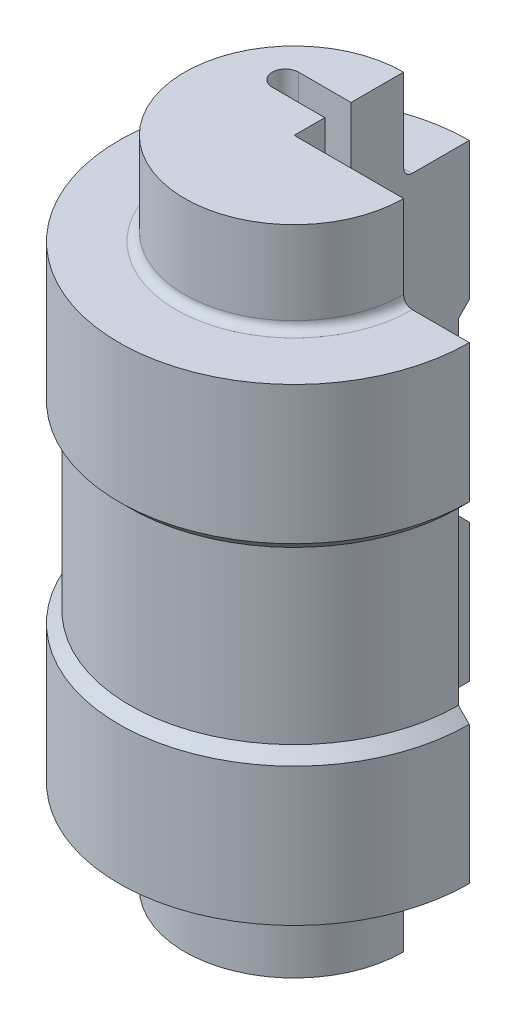
ISO-10303-21;
HEADER;
FILE_DESCRIPTION(('STEP AP214'),'2;1');
FILE_NAME('part.step','',(''),(''),'','','');
FILE_SCHEMA(('AUTOMOTIVE_DESIGN { 1 0 10303 214 1 1 1 1 }'));
ENDSEC;
DATA;
#1=APPLICATION_CONTEXT('core data for automotive mechanical design processes');
#2=APPLICATION_PROTOCOL_DEFINITION('international standard','automotive_design',2000,#1);
#3=PRODUCT_CONTEXT('',#1,'mechanical');
#4=PRODUCT('Part','Part','',(#3));
#5=PRODUCT_RELATED_PRODUCT_CATEGORY('part','',(#4));
#6=PRODUCT_DEFINITION_FORMATION('','',#4);
#7=PRODUCT_DEFINITION_CONTEXT('part definition',#1,'design');
#8=PRODUCT_DEFINITION('design','',#6,#7);
#9=PRODUCT_DEFINITION_SHAPE('','',#8);
#10=(LENGTH_UNIT() NAMED_UNIT(*) SI_UNIT(.MILLI.,.METRE.));
#11=(NAMED_UNIT(*) PLANE_ANGLE_UNIT() SI_UNIT($,.RADIAN.));
#12=(NAMED_UNIT(*) SI_UNIT($,.STERADIAN.) SOLID_ANGLE_UNIT());
#13=UNCERTAINTY_MEASURE_WITH_UNIT(LENGTH_MEASURE(1.E-05),#10,'distance_accuracy_value','');
#14=(GEOMETRIC_REPRESENTATION_CONTEXT(3) GLOBAL_UNCERTAINTY_ASSIGNED_CONTEXT((#13)) GLOBAL_UNIT_ASSIGNED_CONTEXT((#10,
#11,#12)) REPRESENTATION_CONTEXT('',''));
#15=CARTESIAN_POINT('',(0.,0.,0.));
#16=DIRECTION('',(0.,0.,1.));
#17=DIRECTION('',(1.,0.,0.));
#18=AXIS2_PLACEMENT_3D('',#15,#16,#17);
#19=CARTESIAN_POINT('',(0.,166.637084989848,0.));
#20=DIRECTION('',(0.,-1.,0.));
#21=DIRECTION('',(0.,0.,-1.));
#22=AXIS2_PLACEMENT_3D('',#19,#20,#21);
#23=CYLINDRICAL_SURFACE('',#22,37.5);
#24=CARTESIAN_POINT('',(0.,-19.5,0.));
#25=DIRECTION('',(0.,-1.,0.));
#26=DIRECTION('',(0.,0.,-1.));
#27=AXIS2_PLACEMENT_3D('',#24,#25,#26);
#28=CIRCLE('',#27,37.5);
#29=CARTESIAN_POINT('',(37.5,-19.5,0.));
#30=VERTEX_POINT('',#29);
#31=CARTESIAN_POINT('',(0.,-19.5,-37.5));
#32=VERTEX_POINT('',#31);
#33=EDGE_CURVE('E287',#30,#32,#28,.T.);
#34=ORIENTED_EDGE('',*,*,#33,.F.);
#35=DIRECTION('',(0.,-1.,0.));
#36=VECTOR('',#35,1.);
#37=CARTESIAN_POINT('',(37.5,166.637084989848,0.));
#38=LINE('',#37,#36);
#39=CARTESIAN_POINT('',(37.5,19.5,0.));
#40=VERTEX_POINT('',#39);
#41=EDGE_CURVE('E54',#30,#40,#38,.F.);
#42=ORIENTED_EDGE('',*,*,#41,.T.);
#43=CARTESIAN_POINT('',(0.,19.5,0.));
#44=DIRECTION('',(0.,1.,0.));
#45=DIRECTION('',(0.,0.,1.));
#46=AXIS2_PLACEMENT_3D('',#43,#44,#45);
#47=CIRCLE('',#46,37.5);
#48=CARTESIAN_POINT('',(0.,19.5,-37.5));
#49=VERTEX_POINT('',#48);
#50=EDGE_CURVE('E284',#49,#40,#47,.T.);
#51=ORIENTED_EDGE('',*,*,#50,.F.);
#52=DIRECTION('',(0.,-1.,0.));
#53=VECTOR('',#52,1.);
#54=CARTESIAN_POINT('',(0.,166.637084989848,-37.5));
#55=LINE('',#54,#53);
#56=EDGE_CURVE('E165',#49,#32,#55,.T.);
#57=ORIENTED_EDGE('',*,*,#56,.T.);
#58=EDGE_LOOP('',(#34,#42,#51,#57));
#59=FACE_BOUND('',#58,.T.);
#60=ADVANCED_FACE('F39',(#59),#23,.T.);
#61=CARTESIAN_POINT('',(0.,74.5,0.));
#62=DIRECTION('',(0.,-1.,0.));
#63=DIRECTION('',(0.,0.,-1.));
#64=AXIS2_PLACEMENT_3D('',#61,#62,#63);
#65=CYLINDRICAL_SURFACE('',#64,40.);
#66=CARTESIAN_POINT('',(0.,22.,0.));
#67=DIRECTION('',(0.,1.,0.));
#68=DIRECTION('',(0.,0.,1.));
#69=AXIS2_PLACEMENT_3D('',#66,#67,#68);
#70=CIRCLE('',#69,40.);
#71=CARTESIAN_POINT('',(0.,22.,-40.));
#72=VERTEX_POINT('',#71);
#73=CARTESIAN_POINT('',(40.,22.,0.));
#74=VERTEX_POINT('',#73);
#75=EDGE_CURVE('E237',#72,#74,#70,.T.);
#76=ORIENTED_EDGE('',*,*,#75,.T.);
#77=DIRECTION('',(0.,1.,0.));
#78=VECTOR('',#77,1.);
#79=CARTESIAN_POINT('',(40.,-74.5,0.));
#80=LINE('',#79,#78);
#81=CARTESIAN_POINT('',(40.,53.5,0.));
#82=VERTEX_POINT('',#81);
#83=EDGE_CURVE('E185',#74,#82,#80,.T.);
#84=ORIENTED_EDGE('',*,*,#83,.T.);
#85=CARTESIAN_POINT('',(0.,53.5,0.));
#86=DIRECTION('',(0.,1.,0.));
#87=DIRECTION('',(0.,0.,1.));
#88=AXIS2_PLACEMENT_3D('',#85,#86,#87);
#89=CIRCLE('',#88,40.);
#90=CARTESIAN_POINT('',(0.,53.5,-40.));
#91=VERTEX_POINT('',#90);
#92=EDGE_CURVE('E269',#91,#82,#89,.T.);
#93=ORIENTED_EDGE('',*,*,#92,.F.);
#94=DIRECTION('',(0.,1.,0.));
#95=VECTOR('',#94,1.);
#96=CARTESIAN_POINT('',(0.,-74.5,-40.));
#97=LINE('',#96,#95);
#98=EDGE_CURVE('E190',#72,#91,#97,.T.);
#99=ORIENTED_EDGE('',*,*,#98,.F.);
#100=EDGE_LOOP('',(#76,#84,#93,#99));
#101=FACE_BOUND('',#100,.T.);
#102=ADVANCED_FACE('F337',(#101),#65,.T.);
#103=CARTESIAN_POINT('',(0.,53.5,0.));
#104=DIRECTION('',(0.,1.,0.));
#105=DIRECTION('',(0.,0.,1.));
#106=AXIS2_PLACEMENT_3D('',#103,#104,#105);
#107=PLANE('',#106);
#108=DIRECTION('',(1.,0.,0.));
#109=VECTOR('',#108,1.);
#110=CARTESIAN_POINT('',(0.,53.5,0.));
#111=LINE('',#110,#109);
#112=CARTESIAN_POINT('',(27.,53.5,0.));
#113=VERTEX_POINT('',#112);
#114=EDGE_CURVE('E229',#113,#82,#111,.T.);
#115=ORIENTED_EDGE('',*,*,#114,.F.);
#116=CARTESIAN_POINT('',(0.,53.5,0.));
#117=DIRECTION('',(0.,1.,0.));
#118=DIRECTION('',(0.,0.,1.));
#119=AXIS2_PLACEMENT_3D('',#116,#117,#118);
#120=CIRCLE('',#119,27.);
#121=CARTESIAN_POINT('',(0.,53.5,-27.));
#122=VERTEX_POINT('',#121);
#123=EDGE_CURVE('E281',#113,#122,#120,.F.);
#124=ORIENTED_EDGE('',*,*,#123,.T.);
#125=DIRECTION('',(0.,0.,1.));
#126=VECTOR('',#125,1.);
#127=CARTESIAN_POINT('',(0.,53.5,0.));
#128=LINE('',#127,#126);
#129=EDGE_CURVE('E205',#91,#122,#128,.T.);
#130=ORIENTED_EDGE('',*,*,#129,.F.);
#131=ORIENTED_EDGE('',*,*,#92,.T.);
#132=EDGE_LOOP('',(#115,#124,#130,#131));
#133=FACE_BOUND('',#132,.T.);
#134=ADVANCED_FACE('F332',(#133),#107,.T.);
#135=CARTESIAN_POINT('',(0.,53.5,0.));
#136=DIRECTION('',(0.,1.,0.));
#137=DIRECTION('',(0.,0.,1.));
#138=AXIS2_PLACEMENT_3D('',#135,#136,#137);
#139=CYLINDRICAL_SURFACE('',#138,25.);
#140=DIRECTION('',(0.,1.,0.));
#141=VECTOR('',#140,1.);
#142=CARTESIAN_POINT('',(25.,53.5,0.));
#143=LINE('',#142,#141);
#144=CARTESIAN_POINT('',(25.,74.5,0.));
#145=VERTEX_POINT('',#144);
#146=CARTESIAN_POINT('',(25.,55.5,0.));
#147=VERTEX_POINT('',#146);
#148=EDGE_CURVE('E227',#145,#147,#143,.F.);
#149=ORIENTED_EDGE('',*,*,#148,.F.);
#150=CARTESIAN_POINT('',(0.,74.5,0.));
#151=DIRECTION('',(0.,1.,0.));
#152=DIRECTION('',(0.,0.,1.));
#153=AXIS2_PLACEMENT_3D('',#150,#151,#152);
#154=CIRCLE('',#153,25.);
#155=CARTESIAN_POINT('',(0.,74.5,-25.));
#156=VERTEX_POINT('',#155);
#157=EDGE_CURVE('E266',#156,#145,#154,.T.);
#158=ORIENTED_EDGE('',*,*,#157,.F.);
#159=DIRECTION('',(0.,1.,0.));
#160=VECTOR('',#159,1.);
#161=CARTESIAN_POINT('',(0.,53.5,-25.));
#162=LINE('',#161,#160);
#163=CARTESIAN_POINT('',(0.,55.5,-25.));
#164=VERTEX_POINT('',#163);
#165=EDGE_CURVE('E203',#164,#156,#162,.T.);
#166=ORIENTED_EDGE('',*,*,#165,.F.);
#167=CARTESIAN_POINT('',(0.,55.5,0.));
#168=DIRECTION('',(0.,1.,0.));
#169=DIRECTION('',(0.,0.,1.));
#170=AXIS2_PLACEMENT_3D('',#167,#168,#169);
#171=CIRCLE('',#170,25.);
#172=EDGE_CURVE('E278',#164,#147,#171,.T.);
#173=ORIENTED_EDGE('',*,*,#172,.T.);
#174=EDGE_LOOP('',(#149,#158,#166,#173));
#175=FACE_BOUND('',#174,.T.);
#176=ADVANCED_FACE('F325',(#175),#139,.T.);
#177=CARTESIAN_POINT('',(0.,74.5,0.));
#178=DIRECTION('',(0.,1.,0.));
#179=DIRECTION('',(0.,0.,1.));
#180=AXIS2_PLACEMENT_3D('',#177,#178,#179);
#181=PLANE('',#180);
#182=DIRECTION('',(0.,0.,1.));
#183=VECTOR('',#182,1.);
#184=CARTESIAN_POINT('',(0.,74.5,0.));
#185=LINE('',#184,#183);
#186=CARTESIAN_POINT('',(0.,74.5,-13.));
#187=VERTEX_POINT('',#186);
#188=EDGE_CURVE('E175',#156,#187,#185,.T.);
#189=ORIENTED_EDGE('',*,*,#188,.F.);
#190=ORIENTED_EDGE('',*,*,#157,.T.);
#191=DIRECTION('',(1.,0.,0.));
#192=VECTOR('',#191,1.);
#193=CARTESIAN_POINT('',(0.,74.5,0.));
#194=LINE('',#193,#192);
#195=CARTESIAN_POINT('',(0.,74.5,0.));
#196=VERTEX_POINT('',#195);
#197=EDGE_CURVE('E187',#196,#145,#194,.T.);
#198=ORIENTED_EDGE('',*,*,#197,.F.);
#199=CARTESIAN_POINT('',(0.,74.5,-7.));
#200=VERTEX_POINT('',#199);
#201=EDGE_CURVE('E163',#200,#196,#185,.T.);
#202=ORIENTED_EDGE('',*,*,#201,.F.);
#203=DIRECTION('',(1.,0.,0.));
#204=VECTOR('',#203,1.);
#205=CARTESIAN_POINT('',(-12.,74.5,-7.));
#206=LINE('',#205,#204);
#207=CARTESIAN_POINT('',(-12.,74.5,-7.));
#208=VERTEX_POINT('',#207);
#209=EDGE_CURVE('E249',#208,#200,#206,.T.);
#210=ORIENTED_EDGE('',*,*,#209,.F.);
#211=CARTESIAN_POINT('',(-12.,74.5,-10.));
#212=DIRECTION('',(0.,1.,0.));
#213=DIRECTION('',(0.,0.,1.));
#214=AXIS2_PLACEMENT_3D('',#211,#212,#213);
#215=CIRCLE('',#214,3.);
#216=CARTESIAN_POINT('',(-12.,74.5,-13.));
#217=VERTEX_POINT('',#216);
#218=EDGE_CURVE('E240',#217,#208,#215,.T.);
#219=ORIENTED_EDGE('',*,*,#218,.F.);
#220=DIRECTION('',(-1.,0.,0.));
#221=VECTOR('',#220,1.);
#222=CARTESIAN_POINT('',(-12.,74.5,-13.));
#223=LINE('',#222,#221);
#224=EDGE_CURVE('E243',#187,#217,#223,.T.);
#225=ORIENTED_EDGE('',*,*,#224,.F.);
#226=EDGE_LOOP('',(#189,#190,#198,#202,#210,#219,#225));
#227=FACE_BOUND('',#226,.T.);
#228=ADVANCED_FACE('F321',(#227),#181,.T.);
#229=CARTESIAN_POINT('',(0.,-74.5,0.));
#230=DIRECTION('',(0.,1.,0.));
#231=DIRECTION('',(0.,0.,1.));
#232=AXIS2_PLACEMENT_3D('',#229,#230,#231);
#233=PLANE('',#232);
#234=CARTESIAN_POINT('',(0.,-74.5,0.));
#235=DIRECTION('',(0.,1.,0.));
#236=DIRECTION('',(0.,0.,1.));
#237=AXIS2_PLACEMENT_3D('',#234,#235,#236);
#238=CIRCLE('',#237,25.);
#239=CARTESIAN_POINT('',(0.,-74.5,-25.));
#240=VERTEX_POINT('',#239);
#241=CARTESIAN_POINT('',(25.,-74.5,0.));
#242=VERTEX_POINT('',#241);
#243=EDGE_CURVE('E261',#240,#242,#238,.T.);
#244=ORIENTED_EDGE('',*,*,#243,.F.);
#245=DIRECTION('',(0.,0.,1.));
#246=VECTOR('',#245,1.);
#247=CARTESIAN_POINT('',(0.,-74.5,0.));
#248=LINE('',#247,#246);
#249=CARTESIAN_POINT('',(0.,-74.5,-13.));
#250=VERTEX_POINT('',#249);
#251=EDGE_CURVE('E182',#240,#250,#248,.T.);
#252=ORIENTED_EDGE('',*,*,#251,.T.);
#253=DIRECTION('',(-1.,0.,0.));
#254=VECTOR('',#253,1.);
#255=CARTESIAN_POINT('',(-12.,-74.5,-13.));
#256=LINE('',#255,#254);
#257=CARTESIAN_POINT('',(-12.,-74.5,-13.));
#258=VERTEX_POINT('',#257);
#259=EDGE_CURVE('E245',#250,#258,#256,.T.);
#260=ORIENTED_EDGE('',*,*,#259,.T.);
#261=CARTESIAN_POINT('',(-12.,-74.5,-10.));
#262=DIRECTION('',(0.,1.,0.));
#263=DIRECTION('',(0.,0.,1.));
#264=AXIS2_PLACEMENT_3D('',#261,#262,#263);
#265=CIRCLE('',#264,3.);
#266=CARTESIAN_POINT('',(-12.,-74.5,-7.));
#267=VERTEX_POINT('',#266);
#268=EDGE_CURVE('E241',#258,#267,#265,.T.);
#269=ORIENTED_EDGE('',*,*,#268,.T.);
#270=DIRECTION('',(1.,0.,0.));
#271=VECTOR('',#270,1.);
#272=CARTESIAN_POINT('',(-12.,-74.5,-7.));
#273=LINE('',#272,#271);
#274=CARTESIAN_POINT('',(0.,-74.5,-7.));
#275=VERTEX_POINT('',#274);
#276=EDGE_CURVE('E181',#267,#275,#273,.T.);
#277=ORIENTED_EDGE('',*,*,#276,.T.);
#278=CARTESIAN_POINT('',(0.,-74.5,0.));
#279=VERTEX_POINT('',#278);
#280=EDGE_CURVE('E160',#275,#279,#248,.T.);
#281=ORIENTED_EDGE('',*,*,#280,.T.);
#282=DIRECTION('',(1.,0.,0.));
#283=VECTOR('',#282,1.);
#284=CARTESIAN_POINT('',(0.,-74.5,0.));
#285=LINE('',#284,#283);
#286=EDGE_CURVE('E168',#279,#242,#285,.T.);
#287=ORIENTED_EDGE('',*,*,#286,.T.);
#288=EDGE_LOOP('',(#244,#252,#260,#269,#277,#281,#287));
#289=FACE_BOUND('',#288,.T.);
#290=ADVANCED_FACE('F178',(#289),#233,.F.);
#291=CARTESIAN_POINT('',(0.,-53.5,0.));
#292=DIRECTION('',(0.,-1.,0.));
#293=DIRECTION('',(0.,0.,-1.));
#294=AXIS2_PLACEMENT_3D('',#291,#292,#293);
#295=CYLINDRICAL_SURFACE('',#294,25.);
#296=ORIENTED_EDGE('',*,*,#243,.T.);
#297=DIRECTION('',(0.,-1.,0.));
#298=VECTOR('',#297,1.);
#299=CARTESIAN_POINT('',(25.,-53.5,0.));
#300=LINE('',#299,#298);
#301=CARTESIAN_POINT('',(25.,-55.5,0.));
#302=VERTEX_POINT('',#301);
#303=EDGE_CURVE('E171',#242,#302,#300,.F.);
#304=ORIENTED_EDGE('',*,*,#303,.T.);
#305=CARTESIAN_POINT('',(0.,-55.5,0.));
#306=DIRECTION('',(0.,-1.,0.));
#307=DIRECTION('',(0.,0.,-1.));
#308=AXIS2_PLACEMENT_3D('',#305,#306,#307);
#309=CIRCLE('',#308,25.);
#310=CARTESIAN_POINT('',(0.,-55.5,-25.));
#311=VERTEX_POINT('',#310);
#312=EDGE_CURVE('E275',#302,#311,#309,.T.);
#313=ORIENTED_EDGE('',*,*,#312,.T.);
#314=DIRECTION('',(0.,-1.,0.));
#315=VECTOR('',#314,1.);
#316=CARTESIAN_POINT('',(0.,-53.5,-25.));
#317=LINE('',#316,#315);
#318=EDGE_CURVE('E212',#311,#240,#317,.T.);
#319=ORIENTED_EDGE('',*,*,#318,.T.);
#320=EDGE_LOOP('',(#296,#304,#313,#319));
#321=FACE_BOUND('',#320,.T.);
#322=ADVANCED_FACE('F306',(#321),#295,.T.);
#323=CARTESIAN_POINT('',(0.,-53.5,0.));
#324=DIRECTION('',(0.,-1.,0.));
#325=DIRECTION('',(0.,0.,1.));
#326=AXIS2_PLACEMENT_3D('',#323,#324,#325);
#327=PLANE('',#326);
#328=DIRECTION('',(-1.,0.,0.));
#329=VECTOR('',#328,1.);
#330=CARTESIAN_POINT('',(0.,-53.5,0.));
#331=LINE('',#330,#329);
#332=CARTESIAN_POINT('',(40.,-53.5,0.));
#333=VERTEX_POINT('',#332);
#334=CARTESIAN_POINT('',(27.,-53.5,0.));
#335=VERTEX_POINT('',#334);
#336=EDGE_CURVE('E234',#333,#335,#331,.T.);
#337=ORIENTED_EDGE('',*,*,#336,.F.);
#338=CARTESIAN_POINT('',(0.,-53.5,0.));
#339=DIRECTION('',(0.,1.,0.));
#340=DIRECTION('',(0.,0.,1.));
#341=AXIS2_PLACEMENT_3D('',#338,#339,#340);
#342=CIRCLE('',#341,40.);
#343=CARTESIAN_POINT('',(0.,-53.5,-40.));
#344=VERTEX_POINT('',#343);
#345=EDGE_CURVE('E263',#344,#333,#342,.T.);
#346=ORIENTED_EDGE('',*,*,#345,.F.);
#347=DIRECTION('',(0.,0.,-1.));
#348=VECTOR('',#347,1.);
#349=CARTESIAN_POINT('',(0.,-53.5,0.));
#350=LINE('',#349,#348);
#351=CARTESIAN_POINT('',(0.,-53.5,-27.));
#352=VERTEX_POINT('',#351);
#353=EDGE_CURVE('E210',#352,#344,#350,.T.);
#354=ORIENTED_EDGE('',*,*,#353,.F.);
#355=CARTESIAN_POINT('',(0.,-53.5,0.));
#356=DIRECTION('',(0.,-1.,0.));
#357=DIRECTION('',(0.,0.,-1.));
#358=AXIS2_PLACEMENT_3D('',#355,#356,#357);
#359=CIRCLE('',#358,27.);
#360=EDGE_CURVE('E272',#352,#335,#359,.F.);
#361=ORIENTED_EDGE('',*,*,#360,.T.);
#362=EDGE_LOOP('',(#337,#346,#354,#361));
#363=FACE_BOUND('',#362,.T.);
#364=ADVANCED_FACE('F299',(#363),#327,.T.);
#365=ORIENTED_EDGE('',*,*,#345,.T.);
#366=CARTESIAN_POINT('',(40.,-22.,0.));
#367=VERTEX_POINT('',#366);
#368=EDGE_CURVE('E192',#333,#367,#80,.T.);
#369=ORIENTED_EDGE('',*,*,#368,.T.);
#370=CARTESIAN_POINT('',(0.,-22.,0.));
#371=DIRECTION('',(0.,-1.,0.));
#372=DIRECTION('',(0.,0.,-1.));
#373=AXIS2_PLACEMENT_3D('',#370,#371,#372);
#374=CIRCLE('',#373,40.);
#375=CARTESIAN_POINT('',(0.,-22.,-40.));
#376=VERTEX_POINT('',#375);
#377=EDGE_CURVE('E256',#376,#367,#374,.F.);
#378=ORIENTED_EDGE('',*,*,#377,.F.);
#379=EDGE_CURVE('E61',#344,#376,#97,.T.);
#380=ORIENTED_EDGE('',*,*,#379,.F.);
#381=EDGE_LOOP('',(#365,#369,#378,#380));
#382=FACE_BOUND('',#381,.T.);
#383=ADVANCED_FACE('F295',(#382),#65,.T.);
#384=CARTESIAN_POINT('',(-12.,-74.5,-10.));
#385=DIRECTION('',(0.,1.,0.));
#386=DIRECTION('',(0.,0.,1.));
#387=AXIS2_PLACEMENT_3D('',#384,#385,#386);
#388=CYLINDRICAL_SURFACE('',#387,3.);
#389=ORIENTED_EDGE('',*,*,#218,.T.);
#390=DIRECTION('',(0.,1.,0.));
#391=VECTOR('',#390,1.);
#392=CARTESIAN_POINT('',(-12.,-74.5,-7.));
#393=LINE('',#392,#391);
#394=EDGE_CURVE('E247',#267,#208,#393,.T.);
#395=ORIENTED_EDGE('',*,*,#394,.F.);
#396=ORIENTED_EDGE('',*,*,#268,.F.);
#397=DIRECTION('',(0.,1.,0.));
#398=VECTOR('',#397,1.);
#399=CARTESIAN_POINT('',(-12.,-74.5,-13.));
#400=LINE('',#399,#398);
#401=EDGE_CURVE('E253',#258,#217,#400,.T.);
#402=ORIENTED_EDGE('',*,*,#401,.T.);
#403=EDGE_LOOP('',(#389,#395,#396,#402));
#404=FACE_BOUND('',#403,.T.);
#405=ADVANCED_FACE('F315',(#404),#388,.F.);
#406=CARTESIAN_POINT('',(-12.,-74.5,-13.));
#407=DIRECTION('',(0.,0.,-1.));
#408=DIRECTION('',(-1.,0.,0.));
#409=AXIS2_PLACEMENT_3D('',#406,#407,#408);
#410=PLANE('',#409);
#411=ORIENTED_EDGE('',*,*,#259,.F.);
#412=DIRECTION('',(0.,1.,0.));
#413=VECTOR('',#412,1.);
#414=CARTESIAN_POINT('',(0.,-74.5,-13.));
#415=LINE('',#414,#413);
#416=EDGE_CURVE('E217',#250,#187,#415,.T.);
#417=ORIENTED_EDGE('',*,*,#416,.T.);
#418=ORIENTED_EDGE('',*,*,#224,.T.);
#419=ORIENTED_EDGE('',*,*,#401,.F.);
#420=EDGE_LOOP('',(#411,#417,#418,#419));
#421=FACE_BOUND('',#420,.T.);
#422=ADVANCED_FACE('F310',(#421),#410,.F.);
#423=CARTESIAN_POINT('',(-12.,-74.5,-7.));
#424=DIRECTION('',(0.,0.,1.));
#425=DIRECTION('',(1.,0.,0.));
#426=AXIS2_PLACEMENT_3D('',#423,#424,#425);
#427=PLANE('',#426);
#428=ORIENTED_EDGE('',*,*,#209,.T.);
#429=DIRECTION('',(0.,-1.,0.));
#430=VECTOR('',#429,1.);
#431=CARTESIAN_POINT('',(0.,-74.5,-7.));
#432=LINE('',#431,#430);
#433=EDGE_CURVE('E215',#200,#275,#432,.T.);
#434=ORIENTED_EDGE('',*,*,#433,.T.);
#435=ORIENTED_EDGE('',*,*,#276,.F.);
#436=ORIENTED_EDGE('',*,*,#394,.T.);
#437=EDGE_LOOP('',(#428,#434,#435,#436));
#438=FACE_BOUND('',#437,.T.);
#439=ADVANCED_FACE('F318',(#438),#427,.F.);
#440=CARTESIAN_POINT('',(0.,-55.5,0.));
#441=DIRECTION('',(0.,-1.,0.));
#442=DIRECTION('',(0.,0.,-1.));
#443=AXIS2_PLACEMENT_3D('',#440,#441,#442);
#444=TOROIDAL_SURFACE('',#443,27.,2.);
#445=ORIENTED_EDGE('',*,*,#312,.F.);
#446=CARTESIAN_POINT('',(27.,-55.5,0.));
#447=DIRECTION('',(0.,0.,1.));
#448=DIRECTION('',(1.,0.,0.));
#449=AXIS2_PLACEMENT_3D('',#446,#447,#448);
#450=CIRCLE('',#449,2.);
#451=EDGE_CURVE('E231',#302,#335,#450,.F.);
#452=ORIENTED_EDGE('',*,*,#451,.T.);
#453=ORIENTED_EDGE('',*,*,#360,.F.);
#454=CARTESIAN_POINT('',(0.,-55.5,-27.));
#455=DIRECTION('',(-1.,0.,0.));
#456=DIRECTION('',(0.,0.,1.));
#457=AXIS2_PLACEMENT_3D('',#454,#455,#456);
#458=CIRCLE('',#457,2.);
#459=EDGE_CURVE('E207',#352,#311,#458,.F.);
#460=ORIENTED_EDGE('',*,*,#459,.T.);
#461=EDGE_LOOP('',(#445,#452,#453,#460));
#462=FACE_BOUND('',#461,.T.);
#463=ADVANCED_FACE('F304',(#462),#444,.F.);
#464=CARTESIAN_POINT('',(0.,55.5,0.));
#465=DIRECTION('',(0.,1.,0.));
#466=DIRECTION('',(0.,0.,1.));
#467=AXIS2_PLACEMENT_3D('',#464,#465,#466);
#468=TOROIDAL_SURFACE('',#467,27.,2.);
#469=ORIENTED_EDGE('',*,*,#123,.F.);
#470=CARTESIAN_POINT('',(27.,55.5,0.));
#471=DIRECTION('',(0.,0.,1.));
#472=DIRECTION('',(1.,0.,0.));
#473=AXIS2_PLACEMENT_3D('',#470,#471,#472);
#474=CIRCLE('',#473,2.);
#475=EDGE_CURVE('E224',#113,#147,#474,.F.);
#476=ORIENTED_EDGE('',*,*,#475,.T.);
#477=ORIENTED_EDGE('',*,*,#172,.F.);
#478=CARTESIAN_POINT('',(0.,55.5,-27.));
#479=DIRECTION('',(-1.,0.,0.));
#480=DIRECTION('',(0.,0.,1.));
#481=AXIS2_PLACEMENT_3D('',#478,#479,#480);
#482=CIRCLE('',#481,2.);
#483=EDGE_CURVE('E200',#164,#122,#482,.F.);
#484=ORIENTED_EDGE('',*,*,#483,.T.);
#485=EDGE_LOOP('',(#469,#476,#477,#484));
#486=FACE_BOUND('',#485,.T.);
#487=ADVANCED_FACE('F41',(#486),#468,.F.);
#488=CARTESIAN_POINT('',(0.,19.5,0.));
#489=DIRECTION('',(0.,1.,0.));
#490=DIRECTION('',(0.,0.,1.));
#491=AXIS2_PLACEMENT_3D('',#488,#489,#490);
#492=CONICAL_SURFACE('',#491,37.5,0.785398163397443);
#493=ORIENTED_EDGE('',*,*,#50,.T.);
#494=DIRECTION('',(0.707106781186544,0.707106781186551,0.));
#495=VECTOR('',#494,1.);
#496=CARTESIAN_POINT('',(0.,-18.0000000000004,0.));
#497=LINE('',#496,#495);
#498=EDGE_CURVE('E221',#40,#74,#497,.T.);
#499=ORIENTED_EDGE('',*,*,#498,.T.);
#500=ORIENTED_EDGE('',*,*,#75,.F.);
#501=DIRECTION('',(0.,-0.707106781186551,0.707106781186544));
#502=VECTOR('',#501,1.);
#503=CARTESIAN_POINT('',(0.,-18.0000000000004,0.));
#504=LINE('',#503,#502);
#505=EDGE_CURVE('E197',#72,#49,#504,.T.);
#506=ORIENTED_EDGE('',*,*,#505,.T.);
#507=EDGE_LOOP('',(#493,#499,#500,#506));
#508=FACE_BOUND('',#507,.T.);
#509=ADVANCED_FACE('F340',(#508),#492,.T.);
#510=CARTESIAN_POINT('',(0.,-19.5,0.));
#511=DIRECTION('',(0.,-1.,0.));
#512=DIRECTION('',(0.,0.,1.));
#513=AXIS2_PLACEMENT_3D('',#510,#511,#512);
#514=CONICAL_SURFACE('',#513,37.5,0.785398163397443);
#515=ORIENTED_EDGE('',*,*,#377,.T.);
#516=DIRECTION('',(-0.707106781186544,0.707106781186551,0.));
#517=VECTOR('',#516,1.);
#518=CARTESIAN_POINT('',(0.,18.0000000000004,0.));
#519=LINE('',#518,#517);
#520=EDGE_CURVE('E12',#367,#30,#519,.T.);
#521=ORIENTED_EDGE('',*,*,#520,.T.);
#522=ORIENTED_EDGE('',*,*,#33,.T.);
#523=DIRECTION('',(0.,-0.707106781186551,-0.707106781186544));
#524=VECTOR('',#523,1.);
#525=CARTESIAN_POINT('',(0.,18.0000000000004,0.));
#526=LINE('',#525,#524);
#527=EDGE_CURVE('E47',#32,#376,#526,.T.);
#528=ORIENTED_EDGE('',*,*,#527,.T.);
#529=EDGE_LOOP('',(#515,#521,#522,#528));
#530=FACE_BOUND('',#529,.T.);
#531=ADVANCED_FACE('F291',(#530),#514,.T.);
#532=CARTESIAN_POINT('',(0.,-74.5,0.));
#533=DIRECTION('',(-1.,0.,0.));
#534=DIRECTION('',(0.,0.,1.));
#535=AXIS2_PLACEMENT_3D('',#532,#533,#534);
#536=PLANE('',#535);
#537=ORIENTED_EDGE('',*,*,#251,.F.);
#538=ORIENTED_EDGE('',*,*,#318,.F.);
#539=ORIENTED_EDGE('',*,*,#459,.F.);
#540=ORIENTED_EDGE('',*,*,#353,.T.);
#541=ORIENTED_EDGE('',*,*,#379,.T.);
#542=ORIENTED_EDGE('',*,*,#527,.F.);
#543=ORIENTED_EDGE('',*,*,#56,.F.);
#544=ORIENTED_EDGE('',*,*,#505,.F.);
#545=ORIENTED_EDGE('',*,*,#98,.T.);
#546=ORIENTED_EDGE('',*,*,#129,.T.);
#547=ORIENTED_EDGE('',*,*,#483,.F.);
#548=ORIENTED_EDGE('',*,*,#165,.T.);
#549=ORIENTED_EDGE('',*,*,#188,.T.);
#550=ORIENTED_EDGE('',*,*,#416,.F.);
#551=EDGE_LOOP('',(#537,#538,#539,#540,#541,#542,#543,#544,#545,#546,#547,#548,#549,#550));
#552=FACE_BOUND('',#551,.T.);
#553=ADVANCED_FACE('F343',(#552),#536,.F.);
#554=CARTESIAN_POINT('',(0.,-74.5,0.));
#555=DIRECTION('',(0.,0.,1.));
#556=DIRECTION('',(1.,0.,0.));
#557=AXIS2_PLACEMENT_3D('',#554,#555,#556);
#558=PLANE('',#557);
#559=ORIENTED_EDGE('',*,*,#286,.F.);
#560=DIRECTION('',(0.,1.,0.));
#561=VECTOR('',#560,1.);
#562=CARTESIAN_POINT('',(0.,-74.5,0.));
#563=LINE('',#562,#561);
#564=EDGE_CURVE('E156',#279,#196,#563,.T.);
#565=ORIENTED_EDGE('',*,*,#564,.T.);
#566=ORIENTED_EDGE('',*,*,#197,.T.);
#567=ORIENTED_EDGE('',*,*,#148,.T.);
#568=ORIENTED_EDGE('',*,*,#475,.F.);
#569=ORIENTED_EDGE('',*,*,#114,.T.);
#570=ORIENTED_EDGE('',*,*,#83,.F.);
#571=ORIENTED_EDGE('',*,*,#498,.F.);
#572=ORIENTED_EDGE('',*,*,#41,.F.);
#573=ORIENTED_EDGE('',*,*,#520,.F.);
#574=ORIENTED_EDGE('',*,*,#368,.F.);
#575=ORIENTED_EDGE('',*,*,#336,.T.);
#576=ORIENTED_EDGE('',*,*,#451,.F.);
#577=ORIENTED_EDGE('',*,*,#303,.F.);
#578=EDGE_LOOP('',(#559,#565,#566,#567,#568,#569,#570,#571,#572,#573,#574,#575,#576,#577));
#579=FACE_BOUND('',#578,.T.);
#580=ADVANCED_FACE('F169',(#579),#558,.F.);
#581=ORIENTED_EDGE('',*,*,#201,.T.);
#582=ORIENTED_EDGE('',*,*,#564,.F.);
#583=ORIENTED_EDGE('',*,*,#280,.F.);
#584=ORIENTED_EDGE('',*,*,#433,.F.);
#585=EDGE_LOOP('',(#581,#582,#583,#584));
#586=FACE_BOUND('',#585,.T.);
#587=ADVANCED_FACE('F158',(#586),#536,.F.);
#588=CLOSED_SHELL('',(#60,#102,#134,#176,#228,#290,#322,#364,#383,#405,#422,#439,#463,#487,#509,
#531,#553,#580,#587));
#589=MANIFOLD_SOLID_BREP('B2',#588);
#590=ADVANCED_BREP_SHAPE_REPRESENTATION('',(#18,#589),#14);
#591=SHAPE_DEFINITION_REPRESENTATION(#9,#590);
ENDSEC;
END-ISO-10303-21;
